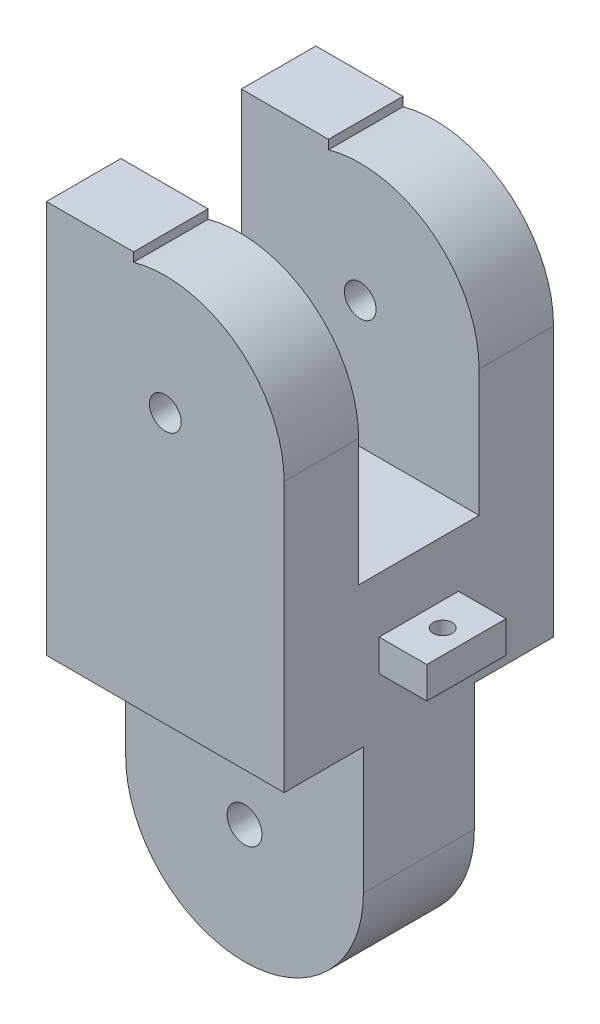
ISO-10303-21;
HEADER;
FILE_DESCRIPTION(('STEP AP214'),'2;1');
FILE_NAME('part.step','',(''),(''),'','','');
FILE_SCHEMA(('AUTOMOTIVE_DESIGN { 1 0 10303 214 1 1 1 1 }'));
ENDSEC;
DATA;
#1=APPLICATION_CONTEXT('core data for automotive mechanical design processes');
#2=APPLICATION_PROTOCOL_DEFINITION('international standard','automotive_design',2000,#1);
#3=PRODUCT_CONTEXT('',#1,'mechanical');
#4=PRODUCT('Part','Part','',(#3));
#5=PRODUCT_RELATED_PRODUCT_CATEGORY('part','',(#4));
#6=PRODUCT_DEFINITION_FORMATION('','',#4);
#7=PRODUCT_DEFINITION_CONTEXT('part definition',#1,'design');
#8=PRODUCT_DEFINITION('design','',#6,#7);
#9=PRODUCT_DEFINITION_SHAPE('','',#8);
#10=(LENGTH_UNIT() NAMED_UNIT(*) SI_UNIT(.MILLI.,.METRE.));
#11=(NAMED_UNIT(*) PLANE_ANGLE_UNIT() SI_UNIT($,.RADIAN.));
#12=(NAMED_UNIT(*) SI_UNIT($,.STERADIAN.) SOLID_ANGLE_UNIT());
#13=UNCERTAINTY_MEASURE_WITH_UNIT(LENGTH_MEASURE(1.E-05),#10,'distance_accuracy_value','');
#14=(GEOMETRIC_REPRESENTATION_CONTEXT(3) GLOBAL_UNCERTAINTY_ASSIGNED_CONTEXT((#13)) GLOBAL_UNIT_ASSIGNED_CONTEXT((#10,
#11,#12)) REPRESENTATION_CONTEXT('',''));
#15=CARTESIAN_POINT('',(0.,0.,0.));
#16=DIRECTION('',(0.,0.,1.));
#17=DIRECTION('',(1.,0.,0.));
#18=AXIS2_PLACEMENT_3D('',#15,#16,#17);
#19=CARTESIAN_POINT('',(0.,25.,8.5));
#20=DIRECTION('',(0.,0.,-1.));
#21=DIRECTION('',(-1.,0.,0.));
#22=AXIS2_PLACEMENT_3D('',#19,#20,#21);
#23=CYLINDRICAL_SURFACE('',#22,7.5);
#24=DIRECTION('',(0.,0.,-1.));
#25=VECTOR('',#24,1.);
#26=CARTESIAN_POINT('',(-2.,32.2284161474005,8.5));
#27=LINE('',#26,#25);
#28=CARTESIAN_POINT('',(-2.,32.2284161474005,-3.8));
#29=VERTEX_POINT('',#28);
#30=CARTESIAN_POINT('',(-2.,32.2284161474005,-8.5));
#31=VERTEX_POINT('',#30);
#32=EDGE_CURVE('E272',#29,#31,#27,.T.);
#33=ORIENTED_EDGE('',*,*,#32,.F.);
#34=CARTESIAN_POINT('',(0.,25.,-3.8));
#35=DIRECTION('',(0.,0.,-1.));
#36=DIRECTION('',(0.,1.,0.));
#37=AXIS2_PLACEMENT_3D('',#34,#35,#36);
#38=CIRCLE('',#37,7.5);
#39=CARTESIAN_POINT('',(7.5,25.,-3.8));
#40=VERTEX_POINT('',#39);
#41=EDGE_CURVE('E248',#29,#40,#38,.T.);
#42=ORIENTED_EDGE('',*,*,#41,.T.);
#43=DIRECTION('',(0.,0.,-1.));
#44=VECTOR('',#43,1.);
#45=CARTESIAN_POINT('',(7.5,25.,8.5));
#46=LINE('',#45,#44);
#47=CARTESIAN_POINT('',(7.5,25.,-8.5));
#48=VERTEX_POINT('',#47);
#49=EDGE_CURVE('E322',#40,#48,#46,.T.);
#50=ORIENTED_EDGE('',*,*,#49,.T.);
#51=CARTESIAN_POINT('',(0.,25.,-8.5));
#52=DIRECTION('',(0.,0.,1.));
#53=DIRECTION('',(1.,0.,0.));
#54=AXIS2_PLACEMENT_3D('',#51,#52,#53);
#55=CIRCLE('',#54,7.5);
#56=EDGE_CURVE('E313',#48,#31,#55,.T.);
#57=ORIENTED_EDGE('',*,*,#56,.T.);
#58=EDGE_LOOP('',(#33,#42,#50,#57));
#59=FACE_BOUND('',#58,.T.);
#60=ADVANCED_FACE('F39',(#59),#23,.T.);
#61=CARTESIAN_POINT('',(7.5,0.,8.5));
#62=DIRECTION('',(-1.,0.,0.));
#63=DIRECTION('',(0.,-1.,0.));
#64=AXIS2_PLACEMENT_3D('',#61,#62,#63);
#65=PLANE('',#64);
#66=DIRECTION('',(0.,0.,-1.));
#67=VECTOR('',#66,1.);
#68=CARTESIAN_POINT('',(7.5,11.5,8.5));
#69=LINE('',#68,#67);
#70=CARTESIAN_POINT('',(7.5,11.5,2.5));
#71=VERTEX_POINT('',#70);
#72=CARTESIAN_POINT('',(7.5,11.5,-2.5));
#73=VERTEX_POINT('',#72);
#74=EDGE_CURVE('E48',#71,#73,#69,.T.);
#75=ORIENTED_EDGE('',*,*,#74,.F.);
#76=DIRECTION('',(0.,1.,0.));
#77=VECTOR('',#76,1.);
#78=CARTESIAN_POINT('',(7.5,0.,2.5));
#79=LINE('',#78,#77);
#80=CARTESIAN_POINT('',(7.5,13.5,2.5));
#81=VERTEX_POINT('',#80);
#82=EDGE_CURVE('E11',#71,#81,#79,.T.);
#83=ORIENTED_EDGE('',*,*,#82,.T.);
#84=DIRECTION('',(0.,0.,1.));
#85=VECTOR('',#84,1.);
#86=CARTESIAN_POINT('',(7.5,13.5,8.5));
#87=LINE('',#86,#85);
#88=CARTESIAN_POINT('',(7.5,13.5,-2.5));
#89=VERTEX_POINT('',#88);
#90=EDGE_CURVE('E351',#89,#81,#87,.T.);
#91=ORIENTED_EDGE('',*,*,#90,.F.);
#92=DIRECTION('',(0.,1.,0.));
#93=VECTOR('',#92,1.);
#94=CARTESIAN_POINT('',(7.5,0.,-2.5));
#95=LINE('',#94,#93);
#96=EDGE_CURVE('E343',#73,#89,#95,.T.);
#97=ORIENTED_EDGE('',*,*,#96,.F.);
#98=EDGE_LOOP('',(#75,#83,#91,#97));
#99=FACE_BOUND('',#98,.T.);
#100=DIRECTION('',(0.,1.,0.));
#101=VECTOR('',#100,1.);
#102=CARTESIAN_POINT('',(7.5,17.,-3.8));
#103=LINE('',#102,#101);
#104=CARTESIAN_POINT('',(7.5,17.,-3.8));
#105=VERTEX_POINT('',#104);
#106=EDGE_CURVE('E218',#105,#40,#103,.T.);
#107=ORIENTED_EDGE('',*,*,#106,.F.);
#108=DIRECTION('',(0.,0.,-1.));
#109=VECTOR('',#108,1.);
#110=CARTESIAN_POINT('',(7.5,17.,-3.8));
#111=LINE('',#110,#109);
#112=CARTESIAN_POINT('',(7.5,17.,3.8));
#113=VERTEX_POINT('',#112);
#114=EDGE_CURVE('E225',#113,#105,#111,.T.);
#115=ORIENTED_EDGE('',*,*,#114,.F.);
#116=DIRECTION('',(0.,-1.,0.));
#117=VECTOR('',#116,1.);
#118=CARTESIAN_POINT('',(7.5,17.,3.8));
#119=LINE('',#118,#117);
#120=CARTESIAN_POINT('',(7.5,25.,3.8));
#121=VERTEX_POINT('',#120);
#122=EDGE_CURVE('E224',#121,#113,#119,.T.);
#123=ORIENTED_EDGE('',*,*,#122,.F.);
#124=CARTESIAN_POINT('',(7.5,25.,8.5));
#125=VERTEX_POINT('',#124);
#126=EDGE_CURVE('E325',#125,#121,#46,.T.);
#127=ORIENTED_EDGE('',*,*,#126,.F.);
#128=DIRECTION('',(0.,1.,0.));
#129=VECTOR('',#128,1.);
#130=CARTESIAN_POINT('',(7.5,0.,8.5));
#131=LINE('',#130,#129);
#132=CARTESIAN_POINT('',(7.5,7.99813007926781,8.5));
#133=VERTEX_POINT('',#132);
#134=EDGE_CURVE('E305',#133,#125,#131,.T.);
#135=ORIENTED_EDGE('',*,*,#134,.F.);
#136=DIRECTION('',(0.,0.,1.));
#137=VECTOR('',#136,1.);
#138=CARTESIAN_POINT('',(7.5,7.99813007926781,3.5));
#139=LINE('',#138,#137);
#140=CARTESIAN_POINT('',(7.5,7.99813007926781,3.5));
#141=VERTEX_POINT('',#140);
#142=EDGE_CURVE('E287',#141,#133,#139,.T.);
#143=ORIENTED_EDGE('',*,*,#142,.F.);
#144=DIRECTION('',(0.,1.,0.));
#145=VECTOR('',#144,1.);
#146=CARTESIAN_POINT('',(7.5,-7.99999999999999,3.5));
#147=LINE('',#146,#145);
#148=CARTESIAN_POINT('',(7.5,0.,3.5));
#149=VERTEX_POINT('',#148);
#150=EDGE_CURVE('E332',#149,#141,#147,.T.);
#151=ORIENTED_EDGE('',*,*,#150,.F.);
#152=DIRECTION('',(0.,0.,-1.));
#153=VECTOR('',#152,1.);
#154=CARTESIAN_POINT('',(7.5,0.,8.5));
#155=LINE('',#154,#153);
#156=CARTESIAN_POINT('',(7.5,0.,-3.5));
#157=VERTEX_POINT('',#156);
#158=EDGE_CURVE('E323',#149,#157,#155,.T.);
#159=ORIENTED_EDGE('',*,*,#158,.T.);
#160=DIRECTION('',(0.,-1.,0.));
#161=VECTOR('',#160,1.);
#162=CARTESIAN_POINT('',(7.5,-7.99999999999999,-3.5));
#163=LINE('',#162,#161);
#164=CARTESIAN_POINT('',(7.5,7.99813007926781,-3.5));
#165=VERTEX_POINT('',#164);
#166=EDGE_CURVE('E340',#165,#157,#163,.T.);
#167=ORIENTED_EDGE('',*,*,#166,.F.);
#168=DIRECTION('',(0.,0.,1.));
#169=VECTOR('',#168,1.);
#170=CARTESIAN_POINT('',(7.5,7.99813007926781,-3.5));
#171=LINE('',#170,#169);
#172=CARTESIAN_POINT('',(7.5,7.99813007926781,-8.5));
#173=VERTEX_POINT('',#172);
#174=EDGE_CURVE('E278',#173,#165,#171,.T.);
#175=ORIENTED_EDGE('',*,*,#174,.F.);
#176=DIRECTION('',(0.,1.,0.));
#177=VECTOR('',#176,1.);
#178=CARTESIAN_POINT('',(7.5,0.,-8.5));
#179=LINE('',#178,#177);
#180=EDGE_CURVE('E301',#173,#48,#179,.T.);
#181=ORIENTED_EDGE('',*,*,#180,.T.);
#182=ORIENTED_EDGE('',*,*,#49,.F.);
#183=EDGE_LOOP('',(#107,#115,#123,#127,#135,#143,#151,#159,#167,#175,#181,#182));
#184=FACE_BOUND('',#183,.T.);
#185=ADVANCED_FACE('F360',(#99,#184),#65,.F.);
#186=CARTESIAN_POINT('',(-2.,25.,8.5));
#187=DIRECTION('',(-1.,0.,0.));
#188=DIRECTION('',(0.,0.,1.));
#189=AXIS2_PLACEMENT_3D('',#186,#187,#188);
#190=PLANE('',#189);
#191=DIRECTION('',(0.,0.,-1.));
#192=VECTOR('',#191,1.);
#193=CARTESIAN_POINT('',(-2.,32.8,8.5));
#194=LINE('',#193,#192);
#195=CARTESIAN_POINT('',(-2.,32.8,-3.8));
#196=VERTEX_POINT('',#195);
#197=CARTESIAN_POINT('',(-2.,32.8,-8.5));
#198=VERTEX_POINT('',#197);
#199=EDGE_CURVE('E266',#196,#198,#194,.T.);
#200=ORIENTED_EDGE('',*,*,#199,.F.);
#201=DIRECTION('',(0.,-1.,0.));
#202=VECTOR('',#201,1.);
#203=CARTESIAN_POINT('',(-2.,25.,-3.8));
#204=LINE('',#203,#202);
#205=EDGE_CURVE('E246',#196,#29,#204,.T.);
#206=ORIENTED_EDGE('',*,*,#205,.T.);
#207=ORIENTED_EDGE('',*,*,#32,.T.);
#208=DIRECTION('',(0.,1.,0.));
#209=VECTOR('',#208,1.);
#210=CARTESIAN_POINT('',(-2.,25.,-8.5));
#211=LINE('',#210,#209);
#212=EDGE_CURVE('E255',#31,#198,#211,.T.);
#213=ORIENTED_EDGE('',*,*,#212,.T.);
#214=EDGE_LOOP('',(#200,#206,#207,#213));
#215=FACE_BOUND('',#214,.T.);
#216=ADVANCED_FACE('F365',(#215),#190,.F.);
#217=CARTESIAN_POINT('',(-7.5,32.8,8.5));
#218=DIRECTION('',(0.,-1.,0.));
#219=DIRECTION('',(0.,0.,-1.));
#220=AXIS2_PLACEMENT_3D('',#217,#218,#219);
#221=PLANE('',#220);
#222=DIRECTION('',(0.,0.,-1.));
#223=VECTOR('',#222,1.);
#224=CARTESIAN_POINT('',(-7.5,32.8,8.5));
#225=LINE('',#224,#223);
#226=CARTESIAN_POINT('',(-7.5,32.8,-3.8));
#227=VERTEX_POINT('',#226);
#228=CARTESIAN_POINT('',(-7.5,32.8,-8.5));
#229=VERTEX_POINT('',#228);
#230=EDGE_CURVE('E256',#227,#229,#225,.T.);
#231=ORIENTED_EDGE('',*,*,#230,.F.);
#232=DIRECTION('',(1.,0.,0.));
#233=VECTOR('',#232,1.);
#234=CARTESIAN_POINT('',(-7.5,32.8,-3.8));
#235=LINE('',#234,#233);
#236=EDGE_CURVE('E345',#227,#196,#235,.T.);
#237=ORIENTED_EDGE('',*,*,#236,.T.);
#238=ORIENTED_EDGE('',*,*,#199,.T.);
#239=DIRECTION('',(-1.,0.,0.));
#240=VECTOR('',#239,1.);
#241=CARTESIAN_POINT('',(-7.5,32.8,-8.5));
#242=LINE('',#241,#240);
#243=EDGE_CURVE('E257',#198,#229,#242,.T.);
#244=ORIENTED_EDGE('',*,*,#243,.T.);
#245=EDGE_LOOP('',(#231,#237,#238,#244));
#246=FACE_BOUND('',#245,.T.);
#247=ADVANCED_FACE('F378',(#246),#221,.F.);
#248=ORIENTED_EDGE('',*,*,#126,.T.);
#249=CARTESIAN_POINT('',(0.,25.,3.8));
#250=DIRECTION('',(0.,0.,1.));
#251=DIRECTION('',(1.,0.,0.));
#252=AXIS2_PLACEMENT_3D('',#249,#250,#251);
#253=CIRCLE('',#252,7.5);
#254=CARTESIAN_POINT('',(-2.,32.2284161474005,3.8));
#255=VERTEX_POINT('',#254);
#256=EDGE_CURVE('E243',#121,#255,#253,.T.);
#257=ORIENTED_EDGE('',*,*,#256,.T.);
#258=CARTESIAN_POINT('',(-2.,32.2284161474005,8.5));
#259=VERTEX_POINT('',#258);
#260=EDGE_CURVE('E275',#259,#255,#27,.T.);
#261=ORIENTED_EDGE('',*,*,#260,.F.);
#262=CARTESIAN_POINT('',(0.,25.,8.5));
#263=DIRECTION('',(0.,0.,1.));
#264=DIRECTION('',(1.,0.,0.));
#265=AXIS2_PLACEMENT_3D('',#262,#263,#264);
#266=CIRCLE('',#265,7.5);
#267=EDGE_CURVE('E302',#125,#259,#266,.T.);
#268=ORIENTED_EDGE('',*,*,#267,.F.);
#269=EDGE_LOOP('',(#248,#257,#261,#268));
#270=FACE_BOUND('',#269,.T.);
#271=ADVANCED_FACE('F408',(#270),#23,.T.);
#272=CARTESIAN_POINT('',(0.,0.,8.5));
#273=DIRECTION('',(0.,0.,-1.));
#274=DIRECTION('',(-1.,0.,0.));
#275=AXIS2_PLACEMENT_3D('',#272,#273,#274);
#276=CYLINDRICAL_SURFACE('',#275,7.5);
#277=DIRECTION('',(0.,0.,-1.));
#278=VECTOR('',#277,1.);
#279=CARTESIAN_POINT('',(-7.5,0.,8.5));
#280=LINE('',#279,#278);
#281=CARTESIAN_POINT('',(-7.5,0.,3.5));
#282=VERTEX_POINT('',#281);
#283=CARTESIAN_POINT('',(-7.5,0.,-3.5));
#284=VERTEX_POINT('',#283);
#285=EDGE_CURVE('E311',#282,#284,#280,.T.);
#286=ORIENTED_EDGE('',*,*,#285,.T.);
#287=CARTESIAN_POINT('',(0.,0.,-3.5));
#288=DIRECTION('',(0.,0.,1.));
#289=DIRECTION('',(1.,0.,0.));
#290=AXIS2_PLACEMENT_3D('',#287,#288,#289);
#291=CIRCLE('',#290,7.5);
#292=EDGE_CURVE('E296',#284,#157,#291,.T.);
#293=ORIENTED_EDGE('',*,*,#292,.T.);
#294=ORIENTED_EDGE('',*,*,#158,.F.);
#295=CARTESIAN_POINT('',(0.,0.,3.5));
#296=DIRECTION('',(0.,0.,-1.));
#297=DIRECTION('',(-1.,0.,0.));
#298=AXIS2_PLACEMENT_3D('',#295,#296,#297);
#299=CIRCLE('',#298,7.5);
#300=EDGE_CURVE('E291',#149,#282,#299,.T.);
#301=ORIENTED_EDGE('',*,*,#300,.T.);
#302=EDGE_LOOP('',(#286,#293,#294,#301));
#303=FACE_BOUND('',#302,.T.);
#304=ADVANCED_FACE('F41',(#303),#276,.T.);
#305=CARTESIAN_POINT('',(-7.5,0.,8.5));
#306=DIRECTION('',(1.,0.,0.));
#307=DIRECTION('',(0.,1.,0.));
#308=AXIS2_PLACEMENT_3D('',#305,#306,#307);
#309=PLANE('',#308);
#310=DIRECTION('',(0.,0.,-1.));
#311=VECTOR('',#310,1.);
#312=CARTESIAN_POINT('',(-7.5,17.,-3.8));
#313=LINE('',#312,#311);
#314=CARTESIAN_POINT('',(-7.5,17.,3.8));
#315=VERTEX_POINT('',#314);
#316=CARTESIAN_POINT('',(-7.5,17.,-3.8));
#317=VERTEX_POINT('',#316);
#318=EDGE_CURVE('E235',#315,#317,#313,.T.);
#319=ORIENTED_EDGE('',*,*,#318,.T.);
#320=DIRECTION('',(0.,1.,0.));
#321=VECTOR('',#320,1.);
#322=CARTESIAN_POINT('',(-7.5,17.,-3.8));
#323=LINE('',#322,#321);
#324=EDGE_CURVE('E228',#317,#227,#323,.T.);
#325=ORIENTED_EDGE('',*,*,#324,.T.);
#326=ORIENTED_EDGE('',*,*,#230,.T.);
#327=DIRECTION('',(0.,-1.,0.));
#328=VECTOR('',#327,1.);
#329=CARTESIAN_POINT('',(-7.5,0.,-8.5));
#330=LINE('',#329,#328);
#331=CARTESIAN_POINT('',(-7.5,7.99813007926781,-8.5));
#332=VERTEX_POINT('',#331);
#333=EDGE_CURVE('E304',#229,#332,#330,.T.);
#334=ORIENTED_EDGE('',*,*,#333,.T.);
#335=DIRECTION('',(0.,0.,1.));
#336=VECTOR('',#335,1.);
#337=CARTESIAN_POINT('',(-7.5,7.99813007926781,-3.5));
#338=LINE('',#337,#336);
#339=CARTESIAN_POINT('',(-7.5,7.99813007926781,-3.5));
#340=VERTEX_POINT('',#339);
#341=EDGE_CURVE('E276',#332,#340,#338,.T.);
#342=ORIENTED_EDGE('',*,*,#341,.T.);
#343=DIRECTION('',(0.,-1.,0.));
#344=VECTOR('',#343,1.);
#345=CARTESIAN_POINT('',(-7.5,-8.,-3.5));
#346=LINE('',#345,#344);
#347=EDGE_CURVE('E277',#340,#284,#346,.T.);
#348=ORIENTED_EDGE('',*,*,#347,.T.);
#349=ORIENTED_EDGE('',*,*,#285,.F.);
#350=DIRECTION('',(0.,1.,0.));
#351=VECTOR('',#350,1.);
#352=CARTESIAN_POINT('',(-7.5,-8.,3.5));
#353=LINE('',#352,#351);
#354=CARTESIAN_POINT('',(-7.5,7.99813007926781,3.5));
#355=VERTEX_POINT('',#354);
#356=EDGE_CURVE('E286',#282,#355,#353,.T.);
#357=ORIENTED_EDGE('',*,*,#356,.T.);
#358=DIRECTION('',(0.,0.,1.));
#359=VECTOR('',#358,1.);
#360=CARTESIAN_POINT('',(-7.5,7.99813007926781,3.5));
#361=LINE('',#360,#359);
#362=CARTESIAN_POINT('',(-7.5,7.99813007926781,8.5));
#363=VERTEX_POINT('',#362);
#364=EDGE_CURVE('E283',#355,#363,#361,.T.);
#365=ORIENTED_EDGE('',*,*,#364,.T.);
#366=DIRECTION('',(0.,-1.,0.));
#367=VECTOR('',#366,1.);
#368=CARTESIAN_POINT('',(-7.5,0.,8.5));
#369=LINE('',#368,#367);
#370=CARTESIAN_POINT('',(-7.5,32.8,8.5));
#371=VERTEX_POINT('',#370);
#372=EDGE_CURVE('E308',#371,#363,#369,.T.);
#373=ORIENTED_EDGE('',*,*,#372,.F.);
#374=CARTESIAN_POINT('',(-7.5,32.8,3.8));
#375=VERTEX_POINT('',#374);
#376=EDGE_CURVE('E263',#371,#375,#225,.T.);
#377=ORIENTED_EDGE('',*,*,#376,.T.);
#378=DIRECTION('',(0.,-1.,0.));
#379=VECTOR('',#378,1.);
#380=CARTESIAN_POINT('',(-7.5,17.,3.8));
#381=LINE('',#380,#379);
#382=EDGE_CURVE('E230',#375,#315,#381,.T.);
#383=ORIENTED_EDGE('',*,*,#382,.T.);
#384=EDGE_LOOP('',(#319,#325,#326,#334,#342,#348,#349,#357,#365,#373,#377,#383));
#385=FACE_BOUND('',#384,.T.);
#386=ADVANCED_FACE('F385',(#385),#309,.F.);
#387=CARTESIAN_POINT('',(0.,0.,8.5));
#388=DIRECTION('',(0.,0.,1.));
#389=DIRECTION('',(1.,0.,0.));
#390=AXIS2_PLACEMENT_3D('',#387,#388,#389);
#391=PLANE('',#390);
#392=CARTESIAN_POINT('',(0.,25.,8.5));
#393=DIRECTION('',(0.,0.,1.));
#394=DIRECTION('',(1.,0.,0.));
#395=AXIS2_PLACEMENT_3D('',#392,#393,#394);
#396=CIRCLE('',#395,1.);
#397=CARTESIAN_POINT('',(1.,25.,8.5));
#398=VERTEX_POINT('',#397);
#399=EDGE_CURVE('E206',#398,#398,#396,.T.);
#400=ORIENTED_EDGE('',*,*,#399,.F.);
#401=EDGE_LOOP('',(#400));
#402=FACE_BOUND('',#401,.T.);
#403=ORIENTED_EDGE('',*,*,#267,.T.);
#404=DIRECTION('',(0.,1.,0.));
#405=VECTOR('',#404,1.);
#406=CARTESIAN_POINT('',(-2.,25.,8.5));
#407=LINE('',#406,#405);
#408=CARTESIAN_POINT('',(-2.,32.8,8.5));
#409=VERTEX_POINT('',#408);
#410=EDGE_CURVE('E254',#259,#409,#407,.T.);
#411=ORIENTED_EDGE('',*,*,#410,.T.);
#412=DIRECTION('',(-1.,0.,0.));
#413=VECTOR('',#412,1.);
#414=CARTESIAN_POINT('',(-7.5,32.8,8.5));
#415=LINE('',#414,#413);
#416=EDGE_CURVE('E253',#409,#371,#415,.T.);
#417=ORIENTED_EDGE('',*,*,#416,.T.);
#418=ORIENTED_EDGE('',*,*,#372,.T.);
#419=DIRECTION('',(-1.,0.,0.));
#420=VECTOR('',#419,1.);
#421=CARTESIAN_POINT('',(0.,7.99813007926781,8.5));
#422=LINE('',#421,#420);
#423=EDGE_CURVE('E328',#133,#363,#422,.T.);
#424=ORIENTED_EDGE('',*,*,#423,.F.);
#425=ORIENTED_EDGE('',*,*,#134,.T.);
#426=EDGE_LOOP('',(#403,#411,#417,#418,#424,#425));
#427=FACE_BOUND('',#426,.T.);
#428=ADVANCED_FACE('F407',(#402,#427),#391,.T.);
#429=CARTESIAN_POINT('',(0.,0.,-8.5));
#430=DIRECTION('',(0.,0.,1.));
#431=DIRECTION('',(1.,0.,0.));
#432=AXIS2_PLACEMENT_3D('',#429,#430,#431);
#433=PLANE('',#432);
#434=CARTESIAN_POINT('',(0.,25.,-8.5));
#435=DIRECTION('',(0.,0.,1.));
#436=DIRECTION('',(1.,0.,0.));
#437=AXIS2_PLACEMENT_3D('',#434,#435,#436);
#438=CIRCLE('',#437,1.);
#439=CARTESIAN_POINT('',(1.,25.,-8.5));
#440=VERTEX_POINT('',#439);
#441=EDGE_CURVE('E189',#440,#440,#438,.T.);
#442=ORIENTED_EDGE('',*,*,#441,.T.);
#443=EDGE_LOOP('',(#442));
#444=FACE_BOUND('',#443,.T.);
#445=ORIENTED_EDGE('',*,*,#333,.F.);
#446=ORIENTED_EDGE('',*,*,#243,.F.);
#447=ORIENTED_EDGE('',*,*,#212,.F.);
#448=ORIENTED_EDGE('',*,*,#56,.F.);
#449=ORIENTED_EDGE('',*,*,#180,.F.);
#450=DIRECTION('',(-1.,0.,0.));
#451=VECTOR('',#450,1.);
#452=CARTESIAN_POINT('',(0.,7.99813007926781,-8.5));
#453=LINE('',#452,#451);
#454=EDGE_CURVE('E326',#173,#332,#453,.T.);
#455=ORIENTED_EDGE('',*,*,#454,.T.);
#456=EDGE_LOOP('',(#445,#446,#447,#448,#449,#455));
#457=FACE_BOUND('',#456,.T.);
#458=ADVANCED_FACE('F381',(#444,#457),#433,.F.);
#459=CARTESIAN_POINT('',(-7.5,-8.,-3.5));
#460=DIRECTION('',(0.,0.,1.));
#461=DIRECTION('',(1.,0.,0.));
#462=AXIS2_PLACEMENT_3D('',#459,#460,#461);
#463=PLANE('',#462);
#464=CARTESIAN_POINT('',(0.,0.,-3.5));
#465=DIRECTION('',(0.,0.,1.));
#466=DIRECTION('',(1.,0.,0.));
#467=AXIS2_PLACEMENT_3D('',#464,#465,#466);
#468=CIRCLE('',#467,1.1);
#469=CARTESIAN_POINT('',(1.1,0.,-3.5));
#470=VERTEX_POINT('',#469);
#471=EDGE_CURVE('E216',#470,#470,#468,.T.);
#472=ORIENTED_EDGE('',*,*,#471,.T.);
#473=EDGE_LOOP('',(#472));
#474=FACE_BOUND('',#473,.T.);
#475=ORIENTED_EDGE('',*,*,#347,.F.);
#476=DIRECTION('',(1.,0.,0.));
#477=VECTOR('',#476,1.);
#478=CARTESIAN_POINT('',(-7.5,7.99813007926781,-3.5));
#479=LINE('',#478,#477);
#480=EDGE_CURVE('E282',#340,#165,#479,.T.);
#481=ORIENTED_EDGE('',*,*,#480,.T.);
#482=ORIENTED_EDGE('',*,*,#166,.T.);
#483=ORIENTED_EDGE('',*,*,#292,.F.);
#484=EDGE_LOOP('',(#475,#481,#482,#483));
#485=FACE_BOUND('',#484,.T.);
#486=ADVANCED_FACE('F393',(#474,#485),#463,.F.);
#487=CARTESIAN_POINT('',(-7.5,7.99813007926781,-3.5));
#488=DIRECTION('',(0.,1.,0.));
#489=DIRECTION('',(0.,0.,1.));
#490=AXIS2_PLACEMENT_3D('',#487,#488,#489);
#491=PLANE('',#490);
#492=ORIENTED_EDGE('',*,*,#174,.T.);
#493=ORIENTED_EDGE('',*,*,#480,.F.);
#494=ORIENTED_EDGE('',*,*,#341,.F.);
#495=ORIENTED_EDGE('',*,*,#454,.F.);
#496=EDGE_LOOP('',(#492,#493,#494,#495));
#497=FACE_BOUND('',#496,.T.);
#498=ADVANCED_FACE('F389',(#497),#491,.F.);
#499=CARTESIAN_POINT('',(-7.5,-8.,3.5));
#500=DIRECTION('',(0.,0.,-1.));
#501=DIRECTION('',(-1.,0.,0.));
#502=AXIS2_PLACEMENT_3D('',#499,#500,#501);
#503=PLANE('',#502);
#504=CARTESIAN_POINT('',(0.,0.,3.5));
#505=DIRECTION('',(0.,0.,-1.));
#506=DIRECTION('',(-1.,0.,0.));
#507=AXIS2_PLACEMENT_3D('',#504,#505,#506);
#508=CIRCLE('',#507,1.1);
#509=CARTESIAN_POINT('',(1.1,0.,3.5));
#510=VERTEX_POINT('',#509);
#511=EDGE_CURVE('E213',#510,#510,#508,.T.);
#512=ORIENTED_EDGE('',*,*,#511,.T.);
#513=EDGE_LOOP('',(#512));
#514=FACE_BOUND('',#513,.T.);
#515=ORIENTED_EDGE('',*,*,#150,.T.);
#516=DIRECTION('',(1.,0.,0.));
#517=VECTOR('',#516,1.);
#518=CARTESIAN_POINT('',(-7.5,7.99813007926781,3.5));
#519=LINE('',#518,#517);
#520=EDGE_CURVE('E273',#355,#141,#519,.T.);
#521=ORIENTED_EDGE('',*,*,#520,.F.);
#522=ORIENTED_EDGE('',*,*,#356,.F.);
#523=ORIENTED_EDGE('',*,*,#300,.F.);
#524=EDGE_LOOP('',(#515,#521,#522,#523));
#525=FACE_BOUND('',#524,.T.);
#526=ADVANCED_FACE('F398',(#514,#525),#503,.F.);
#527=CARTESIAN_POINT('',(-7.5,7.99813007926781,3.5));
#528=DIRECTION('',(0.,1.,0.));
#529=DIRECTION('',(0.,0.,1.));
#530=AXIS2_PLACEMENT_3D('',#527,#528,#529);
#531=PLANE('',#530);
#532=ORIENTED_EDGE('',*,*,#423,.T.);
#533=ORIENTED_EDGE('',*,*,#364,.F.);
#534=ORIENTED_EDGE('',*,*,#520,.T.);
#535=ORIENTED_EDGE('',*,*,#142,.T.);
#536=EDGE_LOOP('',(#532,#533,#534,#535));
#537=FACE_BOUND('',#536,.T.);
#538=ADVANCED_FACE('F405',(#537),#531,.F.);
#539=ORIENTED_EDGE('',*,*,#260,.T.);
#540=DIRECTION('',(0.,1.,0.));
#541=VECTOR('',#540,1.);
#542=CARTESIAN_POINT('',(-2.,25.,3.8));
#543=LINE('',#542,#541);
#544=CARTESIAN_POINT('',(-2.,32.8,3.8));
#545=VERTEX_POINT('',#544);
#546=EDGE_CURVE('E238',#255,#545,#543,.T.);
#547=ORIENTED_EDGE('',*,*,#546,.T.);
#548=EDGE_CURVE('E270',#409,#545,#194,.T.);
#549=ORIENTED_EDGE('',*,*,#548,.F.);
#550=ORIENTED_EDGE('',*,*,#410,.F.);
#551=EDGE_LOOP('',(#539,#547,#549,#550));
#552=FACE_BOUND('',#551,.T.);
#553=ADVANCED_FACE('F413',(#552),#190,.F.);
#554=ORIENTED_EDGE('',*,*,#548,.T.);
#555=DIRECTION('',(-1.,0.,0.));
#556=VECTOR('',#555,1.);
#557=CARTESIAN_POINT('',(-7.5,32.8,3.8));
#558=LINE('',#557,#556);
#559=EDGE_CURVE('E335',#545,#375,#558,.T.);
#560=ORIENTED_EDGE('',*,*,#559,.T.);
#561=ORIENTED_EDGE('',*,*,#376,.F.);
#562=ORIENTED_EDGE('',*,*,#416,.F.);
#563=EDGE_LOOP('',(#554,#560,#561,#562));
#564=FACE_BOUND('',#563,.T.);
#565=ADVANCED_FACE('F420',(#564),#221,.F.);
#566=CARTESIAN_POINT('',(-7.5,17.,-3.8));
#567=DIRECTION('',(0.,0.,-1.));
#568=DIRECTION('',(0.,1.,0.));
#569=AXIS2_PLACEMENT_3D('',#566,#567,#568);
#570=PLANE('',#569);
#571=CARTESIAN_POINT('',(0.,25.,-3.8));
#572=DIRECTION('',(0.,0.,-1.));
#573=DIRECTION('',(0.,1.,0.));
#574=AXIS2_PLACEMENT_3D('',#571,#572,#573);
#575=CIRCLE('',#574,1.);
#576=CARTESIAN_POINT('',(0.,26.,-3.8));
#577=VERTEX_POINT('',#576);
#578=EDGE_CURVE('E215',#577,#577,#575,.T.);
#579=ORIENTED_EDGE('',*,*,#578,.T.);
#580=EDGE_LOOP('',(#579));
#581=FACE_BOUND('',#580,.T.);
#582=ORIENTED_EDGE('',*,*,#205,.F.);
#583=ORIENTED_EDGE('',*,*,#236,.F.);
#584=ORIENTED_EDGE('',*,*,#324,.F.);
#585=DIRECTION('',(1.,0.,0.));
#586=VECTOR('',#585,1.);
#587=CARTESIAN_POINT('',(-7.5,17.,-3.8));
#588=LINE('',#587,#586);
#589=EDGE_CURVE('E236',#317,#105,#588,.T.);
#590=ORIENTED_EDGE('',*,*,#589,.T.);
#591=ORIENTED_EDGE('',*,*,#106,.T.);
#592=ORIENTED_EDGE('',*,*,#41,.F.);
#593=EDGE_LOOP('',(#582,#583,#584,#590,#591,#592));
#594=FACE_BOUND('',#593,.T.);
#595=ADVANCED_FACE('F368',(#581,#594),#570,.F.);
#596=CARTESIAN_POINT('',(-7.5,17.,3.8));
#597=DIRECTION('',(0.,0.,1.));
#598=DIRECTION('',(1.,0.,0.));
#599=AXIS2_PLACEMENT_3D('',#596,#597,#598);
#600=PLANE('',#599);
#601=CARTESIAN_POINT('',(0.,25.,3.8));
#602=DIRECTION('',(0.,0.,1.));
#603=DIRECTION('',(1.,0.,0.));
#604=AXIS2_PLACEMENT_3D('',#601,#602,#603);
#605=CIRCLE('',#604,1.);
#606=CARTESIAN_POINT('',(1.,25.,3.8));
#607=VERTEX_POINT('',#606);
#608=EDGE_CURVE('E212',#607,#607,#605,.T.);
#609=ORIENTED_EDGE('',*,*,#608,.T.);
#610=EDGE_LOOP('',(#609));
#611=FACE_BOUND('',#610,.T.);
#612=ORIENTED_EDGE('',*,*,#122,.T.);
#613=DIRECTION('',(1.,0.,0.));
#614=VECTOR('',#613,1.);
#615=CARTESIAN_POINT('',(-7.5,17.,3.8));
#616=LINE('',#615,#614);
#617=EDGE_CURVE('E232',#315,#113,#616,.T.);
#618=ORIENTED_EDGE('',*,*,#617,.F.);
#619=ORIENTED_EDGE('',*,*,#382,.F.);
#620=ORIENTED_EDGE('',*,*,#559,.F.);
#621=ORIENTED_EDGE('',*,*,#546,.F.);
#622=ORIENTED_EDGE('',*,*,#256,.F.);
#623=EDGE_LOOP('',(#612,#618,#619,#620,#621,#622));
#624=FACE_BOUND('',#623,.T.);
#625=ADVANCED_FACE('F423',(#611,#624),#600,.F.);
#626=CARTESIAN_POINT('',(-7.5,17.,-3.8));
#627=DIRECTION('',(0.,-1.,0.));
#628=DIRECTION('',(0.,0.,-1.));
#629=AXIS2_PLACEMENT_3D('',#626,#627,#628);
#630=PLANE('',#629);
#631=ORIENTED_EDGE('',*,*,#589,.F.);
#632=ORIENTED_EDGE('',*,*,#318,.F.);
#633=ORIENTED_EDGE('',*,*,#617,.T.);
#634=ORIENTED_EDGE('',*,*,#114,.T.);
#635=EDGE_LOOP('',(#631,#632,#633,#634));
#636=FACE_BOUND('',#635,.T.);
#637=ADVANCED_FACE('F421',(#636),#630,.F.);
#638=CARTESIAN_POINT('',(0.,25.,-8.5));
#639=DIRECTION('',(0.,0.,1.));
#640=DIRECTION('',(1.,0.,0.));
#641=AXIS2_PLACEMENT_3D('',#638,#639,#640);
#642=CYLINDRICAL_SURFACE('',#641,1.);
#643=ORIENTED_EDGE('',*,*,#399,.T.);
#644=EDGE_LOOP('',(#643));
#645=FACE_BOUND('',#644,.T.);
#646=ORIENTED_EDGE('',*,*,#608,.F.);
#647=EDGE_LOOP('',(#646));
#648=FACE_BOUND('',#647,.T.);
#649=ADVANCED_FACE('F424',(#645,#648),#642,.F.);
#650=ORIENTED_EDGE('',*,*,#441,.F.);
#651=EDGE_LOOP('',(#650));
#652=FACE_BOUND('',#651,.T.);
#653=ORIENTED_EDGE('',*,*,#578,.F.);
#654=EDGE_LOOP('',(#653));
#655=FACE_BOUND('',#654,.T.);
#656=ADVANCED_FACE('F435',(#652,#655),#642,.F.);
#657=CARTESIAN_POINT('',(0.,0.,-8.5));
#658=DIRECTION('',(0.,0.,1.));
#659=DIRECTION('',(1.,0.,0.));
#660=AXIS2_PLACEMENT_3D('',#657,#658,#659);
#661=CYLINDRICAL_SURFACE('',#660,1.1);
#662=CARTESIAN_POINT('',(1.1,0.,3.5));
#663=CARTESIAN_POINT('',(1.1,0.,3.42708333333333));
#664=CARTESIAN_POINT('',(1.1,0.,3.35416666666667));
#665=CARTESIAN_POINT('',(1.1,0.,3.20833333333333));
#666=CARTESIAN_POINT('',(1.1,0.,3.13541666666667));
#667=CARTESIAN_POINT('',(1.1,0.,2.98958333333333));
#668=CARTESIAN_POINT('',(1.1,0.,2.91666666666667));
#669=CARTESIAN_POINT('',(1.1,0.,2.77083333333333));
#670=CARTESIAN_POINT('',(1.1,0.,2.69791666666667));
#671=CARTESIAN_POINT('',(1.1,0.,2.55208333333333));
#672=CARTESIAN_POINT('',(1.1,0.,2.47916666666667));
#673=CARTESIAN_POINT('',(1.1,0.,2.33333333333333));
#674=CARTESIAN_POINT('',(1.1,0.,2.26041666666667));
#675=CARTESIAN_POINT('',(1.1,0.,2.11458333333333));
#676=CARTESIAN_POINT('',(1.1,0.,2.04166666666667));
#677=CARTESIAN_POINT('',(1.1,0.,1.89583333333333));
#678=CARTESIAN_POINT('',(1.1,0.,1.82291666666667));
#679=CARTESIAN_POINT('',(1.1,0.,1.67708333333333));
#680=CARTESIAN_POINT('',(1.1,0.,1.60416666666667));
#681=CARTESIAN_POINT('',(1.1,0.,1.45833333333333));
#682=CARTESIAN_POINT('',(1.1,0.,1.38541666666667));
#683=CARTESIAN_POINT('',(1.1,0.,1.23958333333333));
#684=CARTESIAN_POINT('',(1.1,0.,1.16666666666667));
#685=CARTESIAN_POINT('',(1.1,0.,1.02083333333333));
#686=CARTESIAN_POINT('',(1.1,0.,0.947916666666667));
#687=CARTESIAN_POINT('',(1.1,0.,0.802083333333334));
#688=CARTESIAN_POINT('',(1.1,0.,0.729166666666667));
#689=CARTESIAN_POINT('',(1.1,0.,0.583333333333334));
#690=CARTESIAN_POINT('',(1.1,0.,0.510416666666667));
#691=CARTESIAN_POINT('',(1.1,0.,0.364583333333334));
#692=CARTESIAN_POINT('',(1.1,0.,0.291666666666667));
#693=CARTESIAN_POINT('',(1.1,0.,0.145833333333333));
#694=CARTESIAN_POINT('',(1.1,0.,0.0729166666666667));
#695=CARTESIAN_POINT('',(1.1,0.,-0.0729166666666667));
#696=CARTESIAN_POINT('',(1.1,0.,-0.145833333333333));
#697=CARTESIAN_POINT('',(1.1,0.,-0.291666666666667));
#698=CARTESIAN_POINT('',(1.1,0.,-0.364583333333334));
#699=CARTESIAN_POINT('',(1.1,0.,-0.510416666666667));
#700=CARTESIAN_POINT('',(1.1,0.,-0.583333333333334));
#701=CARTESIAN_POINT('',(1.1,0.,-0.729166666666667));
#702=CARTESIAN_POINT('',(1.1,0.,-0.802083333333333));
#703=CARTESIAN_POINT('',(1.1,0.,-0.947916666666667));
#704=CARTESIAN_POINT('',(1.1,0.,-1.02083333333333));
#705=CARTESIAN_POINT('',(1.1,0.,-1.16666666666667));
#706=CARTESIAN_POINT('',(1.1,0.,-1.23958333333333));
#707=CARTESIAN_POINT('',(1.1,0.,-1.38541666666667));
#708=CARTESIAN_POINT('',(1.1,0.,-1.45833333333333));
#709=CARTESIAN_POINT('',(1.1,0.,-1.60416666666667));
#710=CARTESIAN_POINT('',(1.1,0.,-1.67708333333333));
#711=CARTESIAN_POINT('',(1.1,0.,-1.82291666666667));
#712=CARTESIAN_POINT('',(1.1,0.,-1.89583333333333));
#713=CARTESIAN_POINT('',(1.1,0.,-2.04166666666667));
#714=CARTESIAN_POINT('',(1.1,0.,-2.11458333333333));
#715=CARTESIAN_POINT('',(1.1,0.,-2.26041666666667));
#716=CARTESIAN_POINT('',(1.1,0.,-2.33333333333333));
#717=CARTESIAN_POINT('',(1.1,0.,-2.47916666666667));
#718=CARTESIAN_POINT('',(1.1,0.,-2.55208333333333));
#719=CARTESIAN_POINT('',(1.1,0.,-2.69791666666667));
#720=CARTESIAN_POINT('',(1.1,0.,-2.77083333333333));
#721=CARTESIAN_POINT('',(1.1,0.,-2.91666666666667));
#722=CARTESIAN_POINT('',(1.1,0.,-2.98958333333333));
#723=CARTESIAN_POINT('',(1.1,0.,-3.13541666666667));
#724=CARTESIAN_POINT('',(1.1,0.,-3.20833333333333));
#725=CARTESIAN_POINT('',(1.1,0.,-3.35416666666667));
#726=CARTESIAN_POINT('',(1.1,0.,-3.42708333333333));
#727=CARTESIAN_POINT('',(1.1,0.,-3.5));
#728=B_SPLINE_CURVE_WITH_KNOTS('',3,(#662,#663,#664,#665,#666,#667,#668,#669,#670,#671,#672,
#673,#674,#675,#676,#677,#678,#679,#680,#681,#682,#683,#684,#685,#686,#687,#688,#689,#690,#691,
#692,#693,#694,#695,#696,#697,#698,#699,#700,#701,#702,#703,#704,#705,#706,#707,#708,#709,#710,
#711,#712,#713,#714,#715,#716,#717,#718,#719,#720,#721,#722,#723,#724,#725,#726,#727),
.UNSPECIFIED.,.F.,.F.,(4,2,2,2,2,2,2,2,2,2,2,2,2,2,2,2,2,2,2,2,2,2,2,2,2,2,2,2,2,2,2,2,4),(0.,
0.21875,0.4375,0.656250000000001,0.875000000000001,1.09375,1.3125,1.53125,1.75,1.96875,2.1875,
2.40625,2.625,2.84375,3.0625,3.28125,3.5,3.71875,3.9375,4.15625,4.375,4.59375,4.8125,5.03125,
5.25,5.46875,5.6875,5.90625,6.125,6.34375,6.5625,6.78125,7.),.UNSPECIFIED.);
#729=EDGE_CURVE('BSEAM561',#510,#470,#728,.T.);
#730=ORIENTED_EDGE('',*,*,#511,.F.);
#731=ORIENTED_EDGE('',*,*,#471,.F.);
#732=ORIENTED_EDGE('',*,*,#729,.T.);
#733=ORIENTED_EDGE('',*,*,#729,.F.);
#734=EDGE_LOOP('',(#730,#732,#731,#733));
#735=FACE_BOUND('',#734,.T.);
#736=ADVANCED_FACE('F561',(#735),#661,.F.);
#737=CARTESIAN_POINT('',(7.,11.5,2.5));
#738=DIRECTION('',(0.,1.,0.));
#739=DIRECTION('',(-1.,0.,0.));
#740=AXIS2_PLACEMENT_3D('',#737,#738,#739);
#741=PLANE('',#740);
#742=CARTESIAN_POINT('',(9.,11.5,0.));
#743=DIRECTION('',(0.,1.,0.));
#744=DIRECTION('',(-1.,0.,0.));
#745=AXIS2_PLACEMENT_3D('',#742,#743,#744);
#746=CIRCLE('',#745,0.6);
#747=CARTESIAN_POINT('',(8.4,11.5,0.));
#748=VERTEX_POINT('',#747);
#749=EDGE_CURVE('E204',#748,#748,#746,.F.);
#750=ORIENTED_EDGE('',*,*,#749,.F.);
#751=EDGE_LOOP('',(#750));
#752=FACE_BOUND('',#751,.T.);
#753=DIRECTION('',(1.,0.,0.));
#754=VECTOR('',#753,1.);
#755=CARTESIAN_POINT('',(7.,11.5,2.5));
#756=LINE('',#755,#754);
#757=CARTESIAN_POINT('',(10.5,11.5,2.5));
#758=VERTEX_POINT('',#757);
#759=EDGE_CURVE('E171',#71,#758,#756,.T.);
#760=ORIENTED_EDGE('',*,*,#759,.F.);
#761=ORIENTED_EDGE('',*,*,#74,.T.);
#762=DIRECTION('',(1.,0.,0.));
#763=VECTOR('',#762,1.);
#764=CARTESIAN_POINT('',(7.,11.5,-2.5));
#765=LINE('',#764,#763);
#766=CARTESIAN_POINT('',(10.5,11.5,-2.5));
#767=VERTEX_POINT('',#766);
#768=EDGE_CURVE('E184',#73,#767,#765,.T.);
#769=ORIENTED_EDGE('',*,*,#768,.T.);
#770=DIRECTION('',(0.,0.,-1.));
#771=VECTOR('',#770,1.);
#772=CARTESIAN_POINT('',(10.5,11.5,2.5));
#773=LINE('',#772,#771);
#774=EDGE_CURVE('E185',#758,#767,#773,.T.);
#775=ORIENTED_EDGE('',*,*,#774,.F.);
#776=EDGE_LOOP('',(#760,#761,#769,#775));
#777=FACE_BOUND('',#776,.T.);
#778=ADVANCED_FACE('F182',(#752,#777),#741,.F.);
#779=CARTESIAN_POINT('',(7.,13.5,2.5));
#780=DIRECTION('',(0.,-1.,0.));
#781=DIRECTION('',(0.,0.,-1.));
#782=AXIS2_PLACEMENT_3D('',#779,#780,#781);
#783=PLANE('',#782);
#784=CARTESIAN_POINT('',(9.,13.5,0.));
#785=DIRECTION('',(0.,-1.,0.));
#786=DIRECTION('',(0.,0.,-1.));
#787=AXIS2_PLACEMENT_3D('',#784,#785,#786);
#788=CIRCLE('',#787,0.6);
#789=CARTESIAN_POINT('',(9.,13.5,-0.6));
#790=VERTEX_POINT('',#789);
#791=EDGE_CURVE('E43',#790,#790,#788,.F.);
#792=ORIENTED_EDGE('',*,*,#791,.F.);
#793=EDGE_LOOP('',(#792));
#794=FACE_BOUND('',#793,.T.);
#795=DIRECTION('',(-1.,0.,0.));
#796=VECTOR('',#795,1.);
#797=CARTESIAN_POINT('',(7.,13.5,-2.5));
#798=LINE('',#797,#796);
#799=CARTESIAN_POINT('',(10.5,13.5,-2.5));
#800=VERTEX_POINT('',#799);
#801=EDGE_CURVE('E177',#800,#89,#798,.T.);
#802=ORIENTED_EDGE('',*,*,#801,.T.);
#803=ORIENTED_EDGE('',*,*,#90,.T.);
#804=DIRECTION('',(-1.,0.,0.));
#805=VECTOR('',#804,1.);
#806=CARTESIAN_POINT('',(7.,13.5,2.5));
#807=LINE('',#806,#805);
#808=CARTESIAN_POINT('',(10.5,13.5,2.5));
#809=VERTEX_POINT('',#808);
#810=EDGE_CURVE('E191',#809,#81,#807,.T.);
#811=ORIENTED_EDGE('',*,*,#810,.F.);
#812=DIRECTION('',(0.,0.,-1.));
#813=VECTOR('',#812,1.);
#814=CARTESIAN_POINT('',(10.5,13.5,2.5));
#815=LINE('',#814,#813);
#816=EDGE_CURVE('E186',#809,#800,#815,.T.);
#817=ORIENTED_EDGE('',*,*,#816,.T.);
#818=EDGE_LOOP('',(#802,#803,#811,#817));
#819=FACE_BOUND('',#818,.T.);
#820=ADVANCED_FACE('F356',(#794,#819),#783,.F.);
#821=CARTESIAN_POINT('',(0.,0.,2.5));
#822=DIRECTION('',(0.,0.,1.));
#823=DIRECTION('',(1.,0.,0.));
#824=AXIS2_PLACEMENT_3D('',#821,#822,#823);
#825=PLANE('',#824);
#826=ORIENTED_EDGE('',*,*,#82,.F.);
#827=ORIENTED_EDGE('',*,*,#759,.T.);
#828=DIRECTION('',(0.,1.,0.));
#829=VECTOR('',#828,1.);
#830=CARTESIAN_POINT('',(10.5,13.5,2.5));
#831=LINE('',#830,#829);
#832=EDGE_CURVE('E176',#758,#809,#831,.T.);
#833=ORIENTED_EDGE('',*,*,#832,.T.);
#834=ORIENTED_EDGE('',*,*,#810,.T.);
#835=EDGE_LOOP('',(#826,#827,#833,#834));
#836=FACE_BOUND('',#835,.T.);
#837=ADVANCED_FACE('F173',(#836),#825,.T.);
#838=CARTESIAN_POINT('',(0.,0.,-2.5));
#839=DIRECTION('',(0.,0.,1.));
#840=DIRECTION('',(1.,0.,0.));
#841=AXIS2_PLACEMENT_3D('',#838,#839,#840);
#842=PLANE('',#841);
#843=ORIENTED_EDGE('',*,*,#768,.F.);
#844=ORIENTED_EDGE('',*,*,#96,.T.);
#845=ORIENTED_EDGE('',*,*,#801,.F.);
#846=DIRECTION('',(0.,1.,0.));
#847=VECTOR('',#846,1.);
#848=CARTESIAN_POINT('',(10.5,13.5,-2.5));
#849=LINE('',#848,#847);
#850=EDGE_CURVE('E199',#767,#800,#849,.T.);
#851=ORIENTED_EDGE('',*,*,#850,.F.);
#852=EDGE_LOOP('',(#843,#844,#845,#851));
#853=FACE_BOUND('',#852,.T.);
#854=ADVANCED_FACE('F352',(#853),#842,.F.);
#855=CARTESIAN_POINT('',(10.5,13.5,2.5));
#856=DIRECTION('',(-1.,0.,0.));
#857=DIRECTION('',(0.,0.,1.));
#858=AXIS2_PLACEMENT_3D('',#855,#856,#857);
#859=PLANE('',#858);
#860=ORIENTED_EDGE('',*,*,#850,.T.);
#861=ORIENTED_EDGE('',*,*,#816,.F.);
#862=ORIENTED_EDGE('',*,*,#832,.F.);
#863=ORIENTED_EDGE('',*,*,#774,.T.);
#864=EDGE_LOOP('',(#860,#861,#862,#863));
#865=FACE_BOUND('',#864,.T.);
#866=ADVANCED_FACE('F192',(#865),#859,.F.);
#867=CARTESIAN_POINT('',(9.,32.8,0.));
#868=DIRECTION('',(0.,-1.,0.));
#869=DIRECTION('',(0.,0.,-1.));
#870=AXIS2_PLACEMENT_3D('',#867,#868,#869);
#871=CYLINDRICAL_SURFACE('',#870,0.6);
#872=ORIENTED_EDGE('',*,*,#791,.T.);
#873=EDGE_LOOP('',(#872));
#874=FACE_BOUND('',#873,.T.);
#875=ORIENTED_EDGE('',*,*,#749,.T.);
#876=EDGE_LOOP('',(#875));
#877=FACE_BOUND('',#876,.T.);
#878=ADVANCED_FACE('F613',(#874,#877),#871,.F.);
#879=CLOSED_SHELL('',(#60,#185,#216,#247,#271,#304,#386,#428,#458,#486,#498,#526,#538,#553,#565,
#595,#625,#637,#649,#656,#736,#778,#820,#837,#854,#866,#878));
#880=MANIFOLD_SOLID_BREP('B2',#879);
#881=ADVANCED_BREP_SHAPE_REPRESENTATION('',(#18,#880),#14);
#882=SHAPE_DEFINITION_REPRESENTATION(#9,#881);
ENDSEC;
END-ISO-10303-21;
